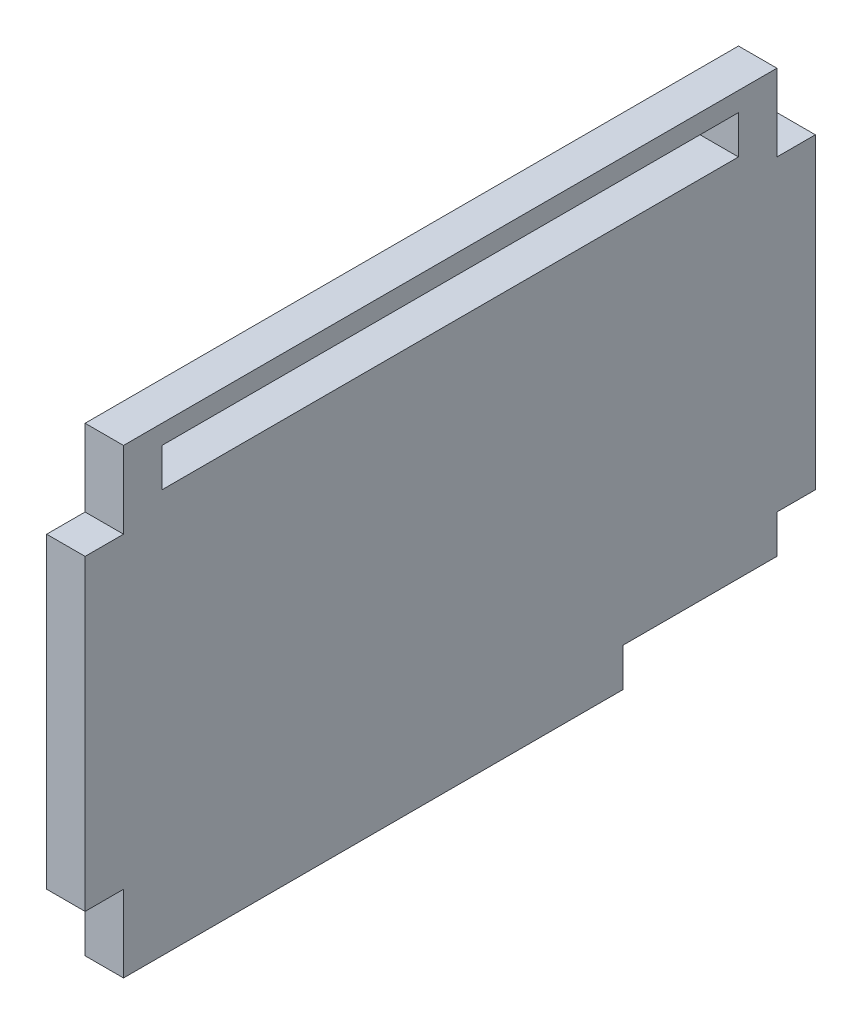
ISO-10303-21;
HEADER;
FILE_DESCRIPTION(('STEP AP214'),'2;1');
FILE_NAME('part.step','',(''),(''),'','','');
FILE_SCHEMA(('AUTOMOTIVE_DESIGN { 1 0 10303 214 1 1 1 1 }'));
ENDSEC;
DATA;
#1=APPLICATION_CONTEXT('core data for automotive mechanical design processes');
#2=APPLICATION_PROTOCOL_DEFINITION('international standard','automotive_design',2000,#1);
#3=PRODUCT_CONTEXT('',#1,'mechanical');
#4=PRODUCT('Part','Part','',(#3));
#5=PRODUCT_RELATED_PRODUCT_CATEGORY('part','',(#4));
#6=PRODUCT_DEFINITION_FORMATION('','',#4);
#7=PRODUCT_DEFINITION_CONTEXT('part definition',#1,'design');
#8=PRODUCT_DEFINITION('design','',#6,#7);
#9=PRODUCT_DEFINITION_SHAPE('','',#8);
#10=(LENGTH_UNIT() NAMED_UNIT(*) SI_UNIT(.MILLI.,.METRE.));
#11=(NAMED_UNIT(*) PLANE_ANGLE_UNIT() SI_UNIT($,.RADIAN.));
#12=(NAMED_UNIT(*) SI_UNIT($,.STERADIAN.) SOLID_ANGLE_UNIT());
#13=UNCERTAINTY_MEASURE_WITH_UNIT(LENGTH_MEASURE(1.E-05),#10,'distance_accuracy_value','');
#14=(GEOMETRIC_REPRESENTATION_CONTEXT(3) GLOBAL_UNCERTAINTY_ASSIGNED_CONTEXT((#13)) GLOBAL_UNIT_ASSIGNED_CONTEXT((#10,
#11,#12)) REPRESENTATION_CONTEXT('',''));
#15=CARTESIAN_POINT('',(0.,0.,0.));
#16=DIRECTION('',(0.,0.,1.));
#17=DIRECTION('',(1.,0.,0.));
#18=AXIS2_PLACEMENT_3D('',#15,#16,#17);
#19=CARTESIAN_POINT('',(0.,0.,0.));
#20=DIRECTION('',(0.,0.,-1.));
#21=DIRECTION('',(-1.,0.,0.));
#22=AXIS2_PLACEMENT_3D('',#19,#20,#21);
#23=PLANE('',#22);
#24=DIRECTION('',(1.,0.,0.));
#25=VECTOR('',#24,1.);
#26=CARTESIAN_POINT('',(-44.45005,-31.75,0.));
#27=LINE('',#26,#25);
#28=CARTESIAN_POINT('',(-44.45,-31.75,0.));
#29=VERTEX_POINT('',#28);
#30=CARTESIAN_POINT('',(-38.1,-31.75,0.));
#31=VERTEX_POINT('',#30);
#32=EDGE_CURVE('E50',#29,#31,#27,.T.);
#33=ORIENTED_EDGE('',*,*,#32,.F.);
#34=DIRECTION('',(0.,-1.,0.));
#35=VECTOR('',#34,1.);
#36=CARTESIAN_POINT('',(-44.45,-38.1,0.));
#37=LINE('',#36,#35);
#38=CARTESIAN_POINT('',(-44.45,-25.4,0.));
#39=VERTEX_POINT('',#38);
#40=EDGE_CURVE('E266',#39,#29,#37,.T.);
#41=ORIENTED_EDGE('',*,*,#40,.F.);
#42=DIRECTION('',(1.,0.,0.));
#43=VECTOR('',#42,1.);
#44=CARTESIAN_POINT('',(-44.45,-25.4,0.));
#45=LINE('',#44,#43);
#46=CARTESIAN_POINT('',(-38.1,-25.4,0.));
#47=VERTEX_POINT('',#46);
#48=EDGE_CURVE('E270',#39,#47,#45,.T.);
#49=ORIENTED_EDGE('',*,*,#48,.T.);
#50=DIRECTION('',(0.,1.,0.));
#51=VECTOR('',#50,1.);
#52=CARTESIAN_POINT('',(-38.1,-38.1,0.));
#53=LINE('',#52,#51);
#54=EDGE_CURVE('E37',#31,#47,#53,.T.);
#55=ORIENTED_EDGE('',*,*,#54,.F.);
#56=EDGE_LOOP('',(#33,#41,#49,#55));
#57=FACE_BOUND('',#56,.T.);
#58=ADVANCED_FACE('F33',(#57),#23,.T.);
#59=CARTESIAN_POINT('',(-44.45,-38.1,114.3));
#60=DIRECTION('',(1.,0.,0.));
#61=DIRECTION('',(0.,0.,-1.));
#62=AXIS2_PLACEMENT_3D('',#59,#60,#61);
#63=PLANE('',#62);
#64=DIRECTION('',(0.,0.,1.));
#65=VECTOR('',#64,1.);
#66=CARTESIAN_POINT('',(-44.45,34.925,114.3));
#67=LINE('',#66,#65);
#68=CARTESIAN_POINT('',(-44.45,34.925,6.35000000000001));
#69=VERTEX_POINT('',#68);
#70=CARTESIAN_POINT('',(-44.45,34.925,101.6));
#71=VERTEX_POINT('',#70);
#72=EDGE_CURVE('E211',#69,#71,#67,.T.);
#73=ORIENTED_EDGE('',*,*,#72,.T.);
#74=DIRECTION('',(0.,-1.,0.));
#75=VECTOR('',#74,1.);
#76=CARTESIAN_POINT('',(-44.45,-38.1,101.6));
#77=LINE('',#76,#75);
#78=CARTESIAN_POINT('',(-44.45,28.575,101.6));
#79=VERTEX_POINT('',#78);
#80=EDGE_CURVE('E214',#71,#79,#77,.T.);
#81=ORIENTED_EDGE('',*,*,#80,.T.);
#82=DIRECTION('',(0.,0.,-1.));
#83=VECTOR('',#82,1.);
#84=CARTESIAN_POINT('',(-44.45,28.575,114.3));
#85=LINE('',#84,#83);
#86=CARTESIAN_POINT('',(-44.45,28.575,6.35000000000001));
#87=VERTEX_POINT('',#86);
#88=EDGE_CURVE('E200',#79,#87,#85,.T.);
#89=ORIENTED_EDGE('',*,*,#88,.T.);
#90=DIRECTION('',(0.,1.,0.));
#91=VECTOR('',#90,1.);
#92=CARTESIAN_POINT('',(-44.45,-38.1,6.35000000000001));
#93=LINE('',#92,#91);
#94=EDGE_CURVE('E208',#87,#69,#93,.T.);
#95=ORIENTED_EDGE('',*,*,#94,.T.);
#96=EDGE_LOOP('',(#73,#81,#89,#95));
#97=FACE_BOUND('',#96,.T.);
#98=DIRECTION('',(0.,0.,1.));
#99=VECTOR('',#98,1.);
#100=CARTESIAN_POINT('',(-44.45,-31.75,114.3));
#101=LINE('',#100,#99);
#102=CARTESIAN_POINT('',(-44.45,-31.75,25.4000000000002));
#103=VERTEX_POINT('',#102);
#104=EDGE_CURVE('E183',#29,#103,#101,.T.);
#105=ORIENTED_EDGE('',*,*,#104,.T.);
#106=DIRECTION('',(0.,-1.,0.));
#107=VECTOR('',#106,1.);
#108=CARTESIAN_POINT('',(-44.45,-38.1,25.4000000000002));
#109=LINE('',#108,#107);
#110=CARTESIAN_POINT('',(-44.45,-38.1,25.4000000000002));
#111=VERTEX_POINT('',#110);
#112=EDGE_CURVE('E166',#103,#111,#109,.T.);
#113=ORIENTED_EDGE('',*,*,#112,.T.);
#114=DIRECTION('',(0.,0.,-1.));
#115=VECTOR('',#114,1.);
#116=CARTESIAN_POINT('',(-44.45,-38.1,114.3));
#117=LINE('',#116,#115);
#118=CARTESIAN_POINT('',(-44.45,-38.1,107.95));
#119=VERTEX_POINT('',#118);
#120=EDGE_CURVE('E278',#119,#111,#117,.T.);
#121=ORIENTED_EDGE('',*,*,#120,.F.);
#122=DIRECTION('',(0.,1.,0.));
#123=VECTOR('',#122,1.);
#124=CARTESIAN_POINT('',(-44.45,-38.1,107.95));
#125=LINE('',#124,#123);
#126=CARTESIAN_POINT('',(-44.45,-25.4,107.95));
#127=VERTEX_POINT('',#126);
#128=EDGE_CURVE('E245',#119,#127,#125,.T.);
#129=ORIENTED_EDGE('',*,*,#128,.T.);
#130=DIRECTION('',(0.,0.,1.));
#131=VECTOR('',#130,1.);
#132=CARTESIAN_POINT('',(-44.45,-25.4,114.3));
#133=LINE('',#132,#131);
#134=CARTESIAN_POINT('',(-44.45,-25.4,114.3));
#135=VERTEX_POINT('',#134);
#136=EDGE_CURVE('E241',#127,#135,#133,.T.);
#137=ORIENTED_EDGE('',*,*,#136,.T.);
#138=DIRECTION('',(0.,-1.,0.));
#139=VECTOR('',#138,1.);
#140=CARTESIAN_POINT('',(-44.45,-38.1,114.3));
#141=LINE('',#140,#139);
#142=CARTESIAN_POINT('',(-44.45,25.4,114.3));
#143=VERTEX_POINT('',#142);
#144=EDGE_CURVE('E318',#143,#135,#141,.T.);
#145=ORIENTED_EDGE('',*,*,#144,.F.);
#146=DIRECTION('',(0.,0.,-1.));
#147=VECTOR('',#146,1.);
#148=CARTESIAN_POINT('',(-44.45,25.4,114.3));
#149=LINE('',#148,#147);
#150=CARTESIAN_POINT('',(-44.45,25.4,107.95));
#151=VERTEX_POINT('',#150);
#152=EDGE_CURVE('E225',#143,#151,#149,.T.);
#153=ORIENTED_EDGE('',*,*,#152,.T.);
#154=DIRECTION('',(0.,1.,0.));
#155=VECTOR('',#154,1.);
#156=CARTESIAN_POINT('',(-44.45,-38.1,107.95));
#157=LINE('',#156,#155);
#158=CARTESIAN_POINT('',(-44.45,38.1,107.95));
#159=VERTEX_POINT('',#158);
#160=EDGE_CURVE('E230',#151,#159,#157,.T.);
#161=ORIENTED_EDGE('',*,*,#160,.T.);
#162=DIRECTION('',(0.,0.,-1.));
#163=VECTOR('',#162,1.);
#164=CARTESIAN_POINT('',(-44.45,38.1,114.3));
#165=LINE('',#164,#163);
#166=CARTESIAN_POINT('',(-44.45,38.1,0.));
#167=VERTEX_POINT('',#166);
#168=EDGE_CURVE('E320',#159,#167,#165,.T.);
#169=ORIENTED_EDGE('',*,*,#168,.T.);
#170=CARTESIAN_POINT('',(-44.45,25.4,0.));
#171=VERTEX_POINT('',#170);
#172=EDGE_CURVE('E292',#167,#171,#37,.T.);
#173=ORIENTED_EDGE('',*,*,#172,.T.);
#174=DIRECTION('',(0.,0.,1.));
#175=VECTOR('',#174,1.);
#176=CARTESIAN_POINT('',(-44.45,25.4,0.));
#177=LINE('',#176,#175);
#178=CARTESIAN_POINT('',(-44.45,25.4,-6.35));
#179=VERTEX_POINT('',#178);
#180=EDGE_CURVE('E252',#179,#171,#177,.T.);
#181=ORIENTED_EDGE('',*,*,#180,.F.);
#182=DIRECTION('',(0.,1.,0.));
#183=VECTOR('',#182,1.);
#184=CARTESIAN_POINT('',(-44.45,25.4,-6.35));
#185=LINE('',#184,#183);
#186=CARTESIAN_POINT('',(-44.45,-25.4,-6.35000000000001));
#187=VERTEX_POINT('',#186);
#188=EDGE_CURVE('E249',#187,#179,#185,.T.);
#189=ORIENTED_EDGE('',*,*,#188,.F.);
#190=DIRECTION('',(0.,0.,-1.));
#191=VECTOR('',#190,1.);
#192=CARTESIAN_POINT('',(-44.45,-25.4,0.));
#193=LINE('',#192,#191);
#194=EDGE_CURVE('E253',#39,#187,#193,.T.);
#195=ORIENTED_EDGE('',*,*,#194,.F.);
#196=ORIENTED_EDGE('',*,*,#40,.T.);
#197=EDGE_LOOP('',(#105,#113,#121,#129,#137,#145,#153,#161,#169,#173,#181,#189,#195,#196));
#198=FACE_BOUND('',#197,.T.);
#199=ADVANCED_FACE('F35',(#97,#198),#63,.F.);
#200=CARTESIAN_POINT('',(-44.45,-38.1,114.3));
#201=DIRECTION('',(0.,1.,0.));
#202=DIRECTION('',(0.,0.,1.));
#203=AXIS2_PLACEMENT_3D('',#200,#201,#202);
#204=PLANE('',#203);
#205=ORIENTED_EDGE('',*,*,#120,.T.);
#206=DIRECTION('',(1.,0.,0.));
#207=VECTOR('',#206,1.);
#208=CARTESIAN_POINT('',(-44.45005,-38.1,25.4000000000002));
#209=LINE('',#208,#207);
#210=CARTESIAN_POINT('',(-38.1,-38.1,25.4000000000002));
#211=VERTEX_POINT('',#210);
#212=EDGE_CURVE('E168',#111,#211,#209,.T.);
#213=ORIENTED_EDGE('',*,*,#212,.T.);
#214=DIRECTION('',(0.,0.,-1.));
#215=VECTOR('',#214,1.);
#216=CARTESIAN_POINT('',(-38.1,-38.1,114.3));
#217=LINE('',#216,#215);
#218=CARTESIAN_POINT('',(-38.1,-38.1,107.95));
#219=VERTEX_POINT('',#218);
#220=EDGE_CURVE('E179',#219,#211,#217,.T.);
#221=ORIENTED_EDGE('',*,*,#220,.F.);
#222=DIRECTION('',(1.,0.,0.));
#223=VECTOR('',#222,1.);
#224=CARTESIAN_POINT('',(-44.45005,-38.1,107.95));
#225=LINE('',#224,#223);
#226=EDGE_CURVE('E239',#119,#219,#225,.T.);
#227=ORIENTED_EDGE('',*,*,#226,.F.);
#228=EDGE_LOOP('',(#205,#213,#221,#227));
#229=FACE_BOUND('',#228,.T.);
#230=ADVANCED_FACE('F363',(#229),#204,.F.);
#231=CARTESIAN_POINT('',(-38.1,-38.1,114.3));
#232=DIRECTION('',(-1.,0.,0.));
#233=DIRECTION('',(0.,0.,1.));
#234=AXIS2_PLACEMENT_3D('',#231,#232,#233);
#235=PLANE('',#234);
#236=DIRECTION('',(0.,0.,-1.));
#237=VECTOR('',#236,1.);
#238=CARTESIAN_POINT('',(-38.1,28.575,101.6));
#239=LINE('',#238,#237);
#240=CARTESIAN_POINT('',(-38.1,28.575,101.6));
#241=VERTEX_POINT('',#240);
#242=CARTESIAN_POINT('',(-38.1,28.575,6.35000000000001));
#243=VERTEX_POINT('',#242);
#244=EDGE_CURVE('E189',#241,#243,#239,.T.);
#245=ORIENTED_EDGE('',*,*,#244,.F.);
#246=DIRECTION('',(0.,-1.,0.));
#247=VECTOR('',#246,1.);
#248=CARTESIAN_POINT('',(-38.1,28.575,101.6));
#249=LINE('',#248,#247);
#250=CARTESIAN_POINT('',(-38.1,34.925,101.6));
#251=VERTEX_POINT('',#250);
#252=EDGE_CURVE('E187',#251,#241,#249,.T.);
#253=ORIENTED_EDGE('',*,*,#252,.F.);
#254=DIRECTION('',(0.,0.,1.));
#255=VECTOR('',#254,1.);
#256=CARTESIAN_POINT('',(-38.1,34.925,101.6));
#257=LINE('',#256,#255);
#258=CARTESIAN_POINT('',(-38.1,34.925,6.35000000000001));
#259=VERTEX_POINT('',#258);
#260=EDGE_CURVE('E194',#259,#251,#257,.T.);
#261=ORIENTED_EDGE('',*,*,#260,.F.);
#262=DIRECTION('',(0.,1.,0.));
#263=VECTOR('',#262,1.);
#264=CARTESIAN_POINT('',(-38.1,28.575,6.35000000000001));
#265=LINE('',#264,#263);
#266=EDGE_CURVE('E191',#243,#259,#265,.T.);
#267=ORIENTED_EDGE('',*,*,#266,.F.);
#268=EDGE_LOOP('',(#245,#253,#261,#267));
#269=FACE_BOUND('',#268,.T.);
#270=ORIENTED_EDGE('',*,*,#220,.T.);
#271=DIRECTION('',(0.,-1.,0.));
#272=VECTOR('',#271,1.);
#273=CARTESIAN_POINT('',(-38.1,-38.1,25.4000000000002));
#274=LINE('',#273,#272);
#275=CARTESIAN_POINT('',(-38.1,-31.75,25.4000000000002));
#276=VERTEX_POINT('',#275);
#277=EDGE_CURVE('E163',#276,#211,#274,.T.);
#278=ORIENTED_EDGE('',*,*,#277,.F.);
#279=DIRECTION('',(0.,0.,1.));
#280=VECTOR('',#279,1.);
#281=CARTESIAN_POINT('',(-38.1,-31.75,0.));
#282=LINE('',#281,#280);
#283=EDGE_CURVE('E170',#31,#276,#282,.T.);
#284=ORIENTED_EDGE('',*,*,#283,.F.);
#285=ORIENTED_EDGE('',*,*,#54,.T.);
#286=DIRECTION('',(0.,0.,-1.));
#287=VECTOR('',#286,1.);
#288=CARTESIAN_POINT('',(-38.1,-25.4,0.));
#289=LINE('',#288,#287);
#290=CARTESIAN_POINT('',(-38.1,-25.4,-6.35000000000001));
#291=VERTEX_POINT('',#290);
#292=EDGE_CURVE('E248',#47,#291,#289,.T.);
#293=ORIENTED_EDGE('',*,*,#292,.T.);
#294=DIRECTION('',(0.,1.,0.));
#295=VECTOR('',#294,1.);
#296=CARTESIAN_POINT('',(-38.1,25.4,-6.35));
#297=LINE('',#296,#295);
#298=CARTESIAN_POINT('',(-38.1,25.4,-6.35));
#299=VERTEX_POINT('',#298);
#300=EDGE_CURVE('E254',#291,#299,#297,.T.);
#301=ORIENTED_EDGE('',*,*,#300,.T.);
#302=DIRECTION('',(0.,0.,1.));
#303=VECTOR('',#302,1.);
#304=CARTESIAN_POINT('',(-38.1,25.4,0.));
#305=LINE('',#304,#303);
#306=CARTESIAN_POINT('',(-38.1,25.4,0.));
#307=VERTEX_POINT('',#306);
#308=EDGE_CURVE('E257',#299,#307,#305,.T.);
#309=ORIENTED_EDGE('',*,*,#308,.T.);
#310=CARTESIAN_POINT('',(-38.1,38.1,0.));
#311=VERTEX_POINT('',#310);
#312=EDGE_CURVE('E296',#307,#311,#53,.T.);
#313=ORIENTED_EDGE('',*,*,#312,.T.);
#314=DIRECTION('',(0.,0.,-1.));
#315=VECTOR('',#314,1.);
#316=CARTESIAN_POINT('',(-38.1,38.1,114.3));
#317=LINE('',#316,#315);
#318=CARTESIAN_POINT('',(-38.1,38.1,107.95));
#319=VERTEX_POINT('',#318);
#320=EDGE_CURVE('E288',#319,#311,#317,.T.);
#321=ORIENTED_EDGE('',*,*,#320,.F.);
#322=DIRECTION('',(0.,1.,0.));
#323=VECTOR('',#322,1.);
#324=CARTESIAN_POINT('',(-38.1,25.4,107.95));
#325=LINE('',#324,#323);
#326=CARTESIAN_POINT('',(-38.1,25.4,107.95));
#327=VERTEX_POINT('',#326);
#328=EDGE_CURVE('E217',#327,#319,#325,.T.);
#329=ORIENTED_EDGE('',*,*,#328,.F.);
#330=DIRECTION('',(0.,0.,-1.));
#331=VECTOR('',#330,1.);
#332=CARTESIAN_POINT('',(-38.1,25.4,107.95));
#333=LINE('',#332,#331);
#334=CARTESIAN_POINT('',(-38.1,25.4,114.3));
#335=VERTEX_POINT('',#334);
#336=EDGE_CURVE('E219',#335,#327,#333,.T.);
#337=ORIENTED_EDGE('',*,*,#336,.F.);
#338=DIRECTION('',(0.,1.,0.));
#339=VECTOR('',#338,1.);
#340=CARTESIAN_POINT('',(-38.1,-38.1,114.3));
#341=LINE('',#340,#339);
#342=CARTESIAN_POINT('',(-38.1,-25.4,114.3));
#343=VERTEX_POINT('',#342);
#344=EDGE_CURVE('E300',#343,#335,#341,.T.);
#345=ORIENTED_EDGE('',*,*,#344,.F.);
#346=DIRECTION('',(0.,0.,1.));
#347=VECTOR('',#346,1.);
#348=CARTESIAN_POINT('',(-38.1,-25.4,107.95));
#349=LINE('',#348,#347);
#350=CARTESIAN_POINT('',(-38.1,-25.4,107.95));
#351=VERTEX_POINT('',#350);
#352=EDGE_CURVE('E236',#351,#343,#349,.T.);
#353=ORIENTED_EDGE('',*,*,#352,.F.);
#354=DIRECTION('',(0.,1.,0.));
#355=VECTOR('',#354,1.);
#356=CARTESIAN_POINT('',(-38.1,-25.4,107.95));
#357=LINE('',#356,#355);
#358=EDGE_CURVE('E233',#219,#351,#357,.T.);
#359=ORIENTED_EDGE('',*,*,#358,.F.);
#360=EDGE_LOOP('',(#270,#278,#284,#285,#293,#301,#309,#313,#321,#329,#337,#345,#353,#359));
#361=FACE_BOUND('',#360,.T.);
#362=ADVANCED_FACE('F176',(#269,#361),#235,.F.);
#363=CARTESIAN_POINT('',(-44.45,38.1,114.3));
#364=DIRECTION('',(0.,-1.,0.));
#365=DIRECTION('',(0.,0.,-1.));
#366=AXIS2_PLACEMENT_3D('',#363,#364,#365);
#367=PLANE('',#366);
#368=ORIENTED_EDGE('',*,*,#168,.F.);
#369=DIRECTION('',(1.,0.,0.));
#370=VECTOR('',#369,1.);
#371=CARTESIAN_POINT('',(-44.45005,38.1,107.95));
#372=LINE('',#371,#370);
#373=EDGE_CURVE('E222',#159,#319,#372,.T.);
#374=ORIENTED_EDGE('',*,*,#373,.T.);
#375=ORIENTED_EDGE('',*,*,#320,.T.);
#376=DIRECTION('',(-1.,0.,0.));
#377=VECTOR('',#376,1.);
#378=CARTESIAN_POINT('',(-44.45,38.1,0.));
#379=LINE('',#378,#377);
#380=EDGE_CURVE('E305',#311,#167,#379,.T.);
#381=ORIENTED_EDGE('',*,*,#380,.T.);
#382=EDGE_LOOP('',(#368,#374,#375,#381));
#383=FACE_BOUND('',#382,.T.);
#384=ADVANCED_FACE('F348',(#383),#367,.F.);
#385=CARTESIAN_POINT('',(0.,0.,114.3));
#386=DIRECTION('',(0.,0.,-1.));
#387=DIRECTION('',(-1.,0.,0.));
#388=AXIS2_PLACEMENT_3D('',#385,#386,#387);
#389=PLANE('',#388);
#390=ORIENTED_EDGE('',*,*,#344,.T.);
#391=DIRECTION('',(-1.,0.,0.));
#392=VECTOR('',#391,1.);
#393=CARTESIAN_POINT('',(0.,25.4,114.3));
#394=LINE('',#393,#392);
#395=EDGE_CURVE('E11',#335,#143,#394,.T.);
#396=ORIENTED_EDGE('',*,*,#395,.T.);
#397=ORIENTED_EDGE('',*,*,#144,.T.);
#398=DIRECTION('',(1.,0.,0.));
#399=VECTOR('',#398,1.);
#400=CARTESIAN_POINT('',(0.,-25.4,114.3));
#401=LINE('',#400,#399);
#402=EDGE_CURVE('E43',#135,#343,#401,.T.);
#403=ORIENTED_EDGE('',*,*,#402,.T.);
#404=EDGE_LOOP('',(#390,#396,#397,#403));
#405=FACE_BOUND('',#404,.T.);
#406=ADVANCED_FACE('F356',(#405),#389,.F.);
#407=DIRECTION('',(1.,0.,0.));
#408=VECTOR('',#407,1.);
#409=CARTESIAN_POINT('',(-44.45,25.4,0.));
#410=LINE('',#409,#408);
#411=EDGE_CURVE('E263',#171,#307,#410,.T.);
#412=ORIENTED_EDGE('',*,*,#411,.F.);
#413=ORIENTED_EDGE('',*,*,#172,.F.);
#414=ORIENTED_EDGE('',*,*,#380,.F.);
#415=ORIENTED_EDGE('',*,*,#312,.F.);
#416=EDGE_LOOP('',(#412,#413,#414,#415));
#417=FACE_BOUND('',#416,.T.);
#418=ADVANCED_FACE('F346',(#417),#23,.T.);
#419=CARTESIAN_POINT('',(-44.45,25.4,0.));
#420=DIRECTION('',(0.,1.,0.));
#421=DIRECTION('',(0.,0.,1.));
#422=AXIS2_PLACEMENT_3D('',#419,#420,#421);
#423=PLANE('',#422);
#424=ORIENTED_EDGE('',*,*,#308,.F.);
#425=DIRECTION('',(1.,0.,0.));
#426=VECTOR('',#425,1.);
#427=CARTESIAN_POINT('',(-44.45,25.4,-6.35));
#428=LINE('',#427,#426);
#429=EDGE_CURVE('E260',#179,#299,#428,.T.);
#430=ORIENTED_EDGE('',*,*,#429,.F.);
#431=ORIENTED_EDGE('',*,*,#180,.T.);
#432=ORIENTED_EDGE('',*,*,#411,.T.);
#433=EDGE_LOOP('',(#424,#430,#431,#432));
#434=FACE_BOUND('',#433,.T.);
#435=ADVANCED_FACE('F343',(#434),#423,.T.);
#436=CARTESIAN_POINT('',(-44.45,25.4,-6.35));
#437=DIRECTION('',(0.,0.,-1.));
#438=DIRECTION('',(0.,1.,0.));
#439=AXIS2_PLACEMENT_3D('',#436,#437,#438);
#440=PLANE('',#439);
#441=ORIENTED_EDGE('',*,*,#300,.F.);
#442=DIRECTION('',(1.,0.,0.));
#443=VECTOR('',#442,1.);
#444=CARTESIAN_POINT('',(-44.45,-25.4,-6.35000000000001));
#445=LINE('',#444,#443);
#446=EDGE_CURVE('E316',#187,#291,#445,.T.);
#447=ORIENTED_EDGE('',*,*,#446,.F.);
#448=ORIENTED_EDGE('',*,*,#188,.T.);
#449=ORIENTED_EDGE('',*,*,#429,.T.);
#450=EDGE_LOOP('',(#441,#447,#448,#449));
#451=FACE_BOUND('',#450,.T.);
#452=ADVANCED_FACE('F339',(#451),#440,.T.);
#453=CARTESIAN_POINT('',(-44.45,-25.4,0.));
#454=DIRECTION('',(0.,-1.,0.));
#455=DIRECTION('',(0.,0.,-1.));
#456=AXIS2_PLACEMENT_3D('',#453,#454,#455);
#457=PLANE('',#456);
#458=ORIENTED_EDGE('',*,*,#292,.F.);
#459=ORIENTED_EDGE('',*,*,#48,.F.);
#460=ORIENTED_EDGE('',*,*,#194,.T.);
#461=ORIENTED_EDGE('',*,*,#446,.T.);
#462=EDGE_LOOP('',(#458,#459,#460,#461));
#463=FACE_BOUND('',#462,.T.);
#464=ADVANCED_FACE('F329',(#463),#457,.T.);
#465=CARTESIAN_POINT('',(-44.45005,-25.4,107.95));
#466=DIRECTION('',(0.,0.,-1.));
#467=DIRECTION('',(-1.,0.,0.));
#468=AXIS2_PLACEMENT_3D('',#465,#466,#467);
#469=PLANE('',#468);
#470=ORIENTED_EDGE('',*,*,#226,.T.);
#471=ORIENTED_EDGE('',*,*,#358,.T.);
#472=DIRECTION('',(1.,0.,0.));
#473=VECTOR('',#472,1.);
#474=CARTESIAN_POINT('',(-44.45005,-25.4,107.95));
#475=LINE('',#474,#473);
#476=EDGE_CURVE('E238',#127,#351,#475,.T.);
#477=ORIENTED_EDGE('',*,*,#476,.F.);
#478=ORIENTED_EDGE('',*,*,#128,.F.);
#479=EDGE_LOOP('',(#470,#471,#477,#478));
#480=FACE_BOUND('',#479,.T.);
#481=ADVANCED_FACE('F361',(#480),#469,.F.);
#482=CARTESIAN_POINT('',(-44.45005,-25.4,107.95));
#483=DIRECTION('',(0.,1.,0.));
#484=DIRECTION('',(0.,0.,1.));
#485=AXIS2_PLACEMENT_3D('',#482,#483,#484);
#486=PLANE('',#485);
#487=ORIENTED_EDGE('',*,*,#476,.T.);
#488=ORIENTED_EDGE('',*,*,#352,.T.);
#489=ORIENTED_EDGE('',*,*,#402,.F.);
#490=ORIENTED_EDGE('',*,*,#136,.F.);
#491=EDGE_LOOP('',(#487,#488,#489,#490));
#492=FACE_BOUND('',#491,.T.);
#493=ADVANCED_FACE('F359',(#492),#486,.F.);
#494=CARTESIAN_POINT('',(-44.45005,25.4,107.95));
#495=DIRECTION('',(0.,0.,-1.));
#496=DIRECTION('',(-1.,0.,0.));
#497=AXIS2_PLACEMENT_3D('',#494,#495,#496);
#498=PLANE('',#497);
#499=DIRECTION('',(1.,0.,0.));
#500=VECTOR('',#499,1.);
#501=CARTESIAN_POINT('',(-44.45005,25.4,107.95));
#502=LINE('',#501,#500);
#503=EDGE_CURVE('E223',#151,#327,#502,.T.);
#504=ORIENTED_EDGE('',*,*,#503,.T.);
#505=ORIENTED_EDGE('',*,*,#328,.T.);
#506=ORIENTED_EDGE('',*,*,#373,.F.);
#507=ORIENTED_EDGE('',*,*,#160,.F.);
#508=EDGE_LOOP('',(#504,#505,#506,#507));
#509=FACE_BOUND('',#508,.T.);
#510=ADVANCED_FACE('F352',(#509),#498,.F.);
#511=CARTESIAN_POINT('',(-44.45005,25.4,107.95));
#512=DIRECTION('',(0.,-1.,0.));
#513=DIRECTION('',(0.,0.,-1.));
#514=AXIS2_PLACEMENT_3D('',#511,#512,#513);
#515=PLANE('',#514);
#516=ORIENTED_EDGE('',*,*,#395,.F.);
#517=ORIENTED_EDGE('',*,*,#336,.T.);
#518=ORIENTED_EDGE('',*,*,#503,.F.);
#519=ORIENTED_EDGE('',*,*,#152,.F.);
#520=EDGE_LOOP('',(#516,#517,#518,#519));
#521=FACE_BOUND('',#520,.T.);
#522=ADVANCED_FACE('F355',(#521),#515,.F.);
#523=CARTESIAN_POINT('',(-44.45005,28.575,101.6));
#524=DIRECTION('',(0.,0.,1.));
#525=DIRECTION('',(1.,0.,0.));
#526=AXIS2_PLACEMENT_3D('',#523,#524,#525);
#527=PLANE('',#526);
#528=DIRECTION('',(1.,0.,0.));
#529=VECTOR('',#528,1.);
#530=CARTESIAN_POINT('',(-44.45005,34.925,101.6));
#531=LINE('',#530,#529);
#532=EDGE_CURVE('E198',#71,#251,#531,.T.);
#533=ORIENTED_EDGE('',*,*,#532,.T.);
#534=ORIENTED_EDGE('',*,*,#252,.T.);
#535=DIRECTION('',(1.,0.,0.));
#536=VECTOR('',#535,1.);
#537=CARTESIAN_POINT('',(-44.45005,28.575,101.6));
#538=LINE('',#537,#536);
#539=EDGE_CURVE('E197',#79,#241,#538,.T.);
#540=ORIENTED_EDGE('',*,*,#539,.F.);
#541=ORIENTED_EDGE('',*,*,#80,.F.);
#542=EDGE_LOOP('',(#533,#534,#540,#541));
#543=FACE_BOUND('',#542,.T.);
#544=ADVANCED_FACE('F400',(#543),#527,.F.);
#545=CARTESIAN_POINT('',(-44.45005,34.925,101.6));
#546=DIRECTION('',(0.,1.,0.));
#547=DIRECTION('',(0.,0.,1.));
#548=AXIS2_PLACEMENT_3D('',#545,#546,#547);
#549=PLANE('',#548);
#550=DIRECTION('',(1.,0.,0.));
#551=VECTOR('',#550,1.);
#552=CARTESIAN_POINT('',(-44.45005,34.925,6.35000000000001));
#553=LINE('',#552,#551);
#554=EDGE_CURVE('E201',#69,#259,#553,.T.);
#555=ORIENTED_EDGE('',*,*,#554,.T.);
#556=ORIENTED_EDGE('',*,*,#260,.T.);
#557=ORIENTED_EDGE('',*,*,#532,.F.);
#558=ORIENTED_EDGE('',*,*,#72,.F.);
#559=EDGE_LOOP('',(#555,#556,#557,#558));
#560=FACE_BOUND('',#559,.T.);
#561=ADVANCED_FACE('F403',(#560),#549,.F.);
#562=CARTESIAN_POINT('',(-44.45005,28.575,6.35000000000001));
#563=DIRECTION('',(0.,0.,-1.));
#564=DIRECTION('',(-1.,0.,0.));
#565=AXIS2_PLACEMENT_3D('',#562,#563,#564);
#566=PLANE('',#565);
#567=DIRECTION('',(1.,0.,0.));
#568=VECTOR('',#567,1.);
#569=CARTESIAN_POINT('',(-44.45005,28.575,6.35000000000001));
#570=LINE('',#569,#568);
#571=EDGE_CURVE('E58',#87,#243,#570,.T.);
#572=ORIENTED_EDGE('',*,*,#571,.T.);
#573=ORIENTED_EDGE('',*,*,#266,.T.);
#574=ORIENTED_EDGE('',*,*,#554,.F.);
#575=ORIENTED_EDGE('',*,*,#94,.F.);
#576=EDGE_LOOP('',(#572,#573,#574,#575));
#577=FACE_BOUND('',#576,.T.);
#578=ADVANCED_FACE('F408',(#577),#566,.F.);
#579=CARTESIAN_POINT('',(-44.45005,28.575,101.6));
#580=DIRECTION('',(0.,-1.,0.));
#581=DIRECTION('',(0.,0.,-1.));
#582=AXIS2_PLACEMENT_3D('',#579,#580,#581);
#583=PLANE('',#582);
#584=ORIENTED_EDGE('',*,*,#539,.T.);
#585=ORIENTED_EDGE('',*,*,#244,.T.);
#586=ORIENTED_EDGE('',*,*,#571,.F.);
#587=ORIENTED_EDGE('',*,*,#88,.F.);
#588=EDGE_LOOP('',(#584,#585,#586,#587));
#589=FACE_BOUND('',#588,.T.);
#590=ADVANCED_FACE('F405',(#589),#583,.F.);
#591=CARTESIAN_POINT('',(-44.45005,-38.1,25.4000000000002));
#592=DIRECTION('',(0.,0.,1.));
#593=DIRECTION('',(1.,0.,0.));
#594=AXIS2_PLACEMENT_3D('',#591,#592,#593);
#595=PLANE('',#594);
#596=DIRECTION('',(1.,0.,0.));
#597=VECTOR('',#596,1.);
#598=CARTESIAN_POINT('',(-44.45005,-31.75,25.4000000000002));
#599=LINE('',#598,#597);
#600=EDGE_CURVE('E160',#103,#276,#599,.T.);
#601=ORIENTED_EDGE('',*,*,#600,.T.);
#602=ORIENTED_EDGE('',*,*,#277,.T.);
#603=ORIENTED_EDGE('',*,*,#212,.F.);
#604=ORIENTED_EDGE('',*,*,#112,.F.);
#605=EDGE_LOOP('',(#601,#602,#603,#604));
#606=FACE_BOUND('',#605,.T.);
#607=ADVANCED_FACE('F161',(#606),#595,.F.);
#608=CARTESIAN_POINT('',(-44.45005,-31.75,0.));
#609=DIRECTION('',(0.,1.,0.));
#610=DIRECTION('',(0.,0.,1.));
#611=AXIS2_PLACEMENT_3D('',#608,#609,#610);
#612=PLANE('',#611);
#613=ORIENTED_EDGE('',*,*,#32,.T.);
#614=ORIENTED_EDGE('',*,*,#283,.T.);
#615=ORIENTED_EDGE('',*,*,#600,.F.);
#616=ORIENTED_EDGE('',*,*,#104,.F.);
#617=EDGE_LOOP('',(#613,#614,#615,#616));
#618=FACE_BOUND('',#617,.T.);
#619=ADVANCED_FACE('F171',(#618),#612,.F.);
#620=CLOSED_SHELL('',(#58,#199,#230,#362,#384,#406,#418,#435,#452,#464,#481,#493,#510,#522,#544,
#561,#578,#590,#607,#619));
#621=MANIFOLD_SOLID_BREP('B2',#620);
#622=ADVANCED_BREP_SHAPE_REPRESENTATION('',(#18,#621),#14);
#623=SHAPE_DEFINITION_REPRESENTATION(#9,#622);
ENDSEC;
END-ISO-10303-21;
